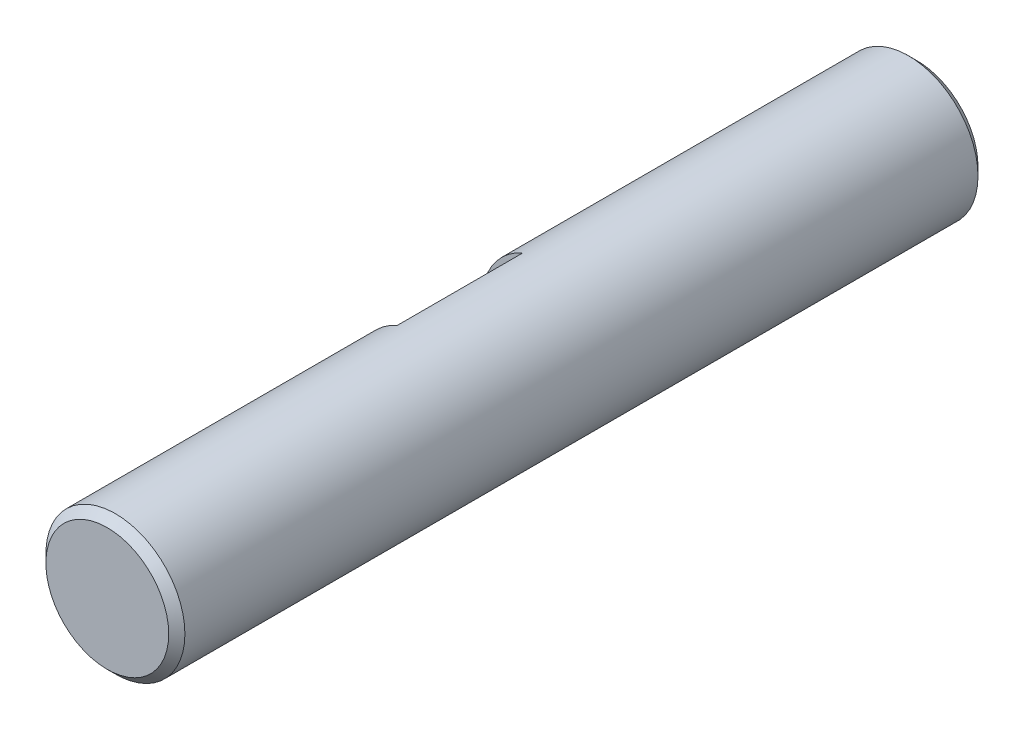
ISO-10303-21;
HEADER;
FILE_DESCRIPTION(('STEP AP214'),'2;1');
FILE_NAME('part.step','',(''),(''),'','','');
FILE_SCHEMA(('AUTOMOTIVE_DESIGN { 1 0 10303 214 1 1 1 1 }'));
ENDSEC;
DATA;
#1=APPLICATION_CONTEXT('core data for automotive mechanical design processes');
#2=APPLICATION_PROTOCOL_DEFINITION('international standard','automotive_design',2000,#1);
#3=PRODUCT_CONTEXT('',#1,'mechanical');
#4=PRODUCT('Part','Part','',(#3));
#5=PRODUCT_RELATED_PRODUCT_CATEGORY('part','',(#4));
#6=PRODUCT_DEFINITION_FORMATION('','',#4);
#7=PRODUCT_DEFINITION_CONTEXT('part definition',#1,'design');
#8=PRODUCT_DEFINITION('design','',#6,#7);
#9=PRODUCT_DEFINITION_SHAPE('','',#8);
#10=(LENGTH_UNIT() NAMED_UNIT(*) SI_UNIT(.MILLI.,.METRE.));
#11=(NAMED_UNIT(*) PLANE_ANGLE_UNIT() SI_UNIT($,.RADIAN.));
#12=(NAMED_UNIT(*) SI_UNIT($,.STERADIAN.) SOLID_ANGLE_UNIT());
#13=UNCERTAINTY_MEASURE_WITH_UNIT(LENGTH_MEASURE(1.E-05),#10,'distance_accuracy_value','');
#14=(GEOMETRIC_REPRESENTATION_CONTEXT(3) GLOBAL_UNCERTAINTY_ASSIGNED_CONTEXT((#13)) GLOBAL_UNIT_ASSIGNED_CONTEXT((#10,
#11,#12)) REPRESENTATION_CONTEXT('',''));
#15=CARTESIAN_POINT('',(0.,0.,0.));
#16=DIRECTION('',(0.,0.,1.));
#17=DIRECTION('',(1.,0.,0.));
#18=AXIS2_PLACEMENT_3D('',#15,#16,#17);
#19=CARTESIAN_POINT('',(0.,-4.38188552176432,-14.4100088425494));
#20=DIRECTION('',(0.,0.,1.));
#21=DIRECTION('',(0.,-1.,0.));
#22=AXIS2_PLACEMENT_3D('',#19,#20,#21);
#23=PLANE('',#22);
#24=CARTESIAN_POINT('',(0.,-4.38188552176432,-14.4100088425494));
#25=DIRECTION('',(0.,0.,1.));
#26=DIRECTION('',(-1.,0.,0.));
#27=AXIS2_PLACEMENT_3D('',#24,#25,#26);
#28=CIRCLE('',#27,2.19994112549696);
#29=CARTESIAN_POINT('',(2.19994112549687,-4.38188552176433,-14.4100088425494));
#30=VERTEX_POINT('',#29);
#31=EDGE_CURVE('E11',#30,#30,#28,.T.);
#32=ORIENTED_EDGE('',*,*,#31,.T.);
#33=EDGE_LOOP('',(#32));
#34=FACE_BOUND('',#33,.T.);
#35=ADVANCED_FACE('F17',(#34),#23,.T.);
#36=CARTESIAN_POINT('',(0.,-4.38188552176432,-14.5670382798009));
#37=DIRECTION('',(0.,0.,-1.));
#38=DIRECTION('',(-1.,0.,0.));
#39=AXIS2_PLACEMENT_3D('',#36,#37,#38);
#40=CONICAL_SURFACE('',#39,2.35697056274848,0.785398163397448);
#41=CARTESIAN_POINT('',(0.,-4.38188552176431,-14.7000677170524));
#42=DIRECTION('',(0.,0.,-1.));
#43=DIRECTION('',(-1.,0.,0.));
#44=AXIS2_PLACEMENT_3D('',#41,#42,#43);
#45=CIRCLE('',#44,2.49);
#46=CARTESIAN_POINT('',(2.49000000000006,-4.38188552176431,-14.7000677170524));
#47=VERTEX_POINT('',#46);
#48=EDGE_CURVE('E117',#47,#47,#45,.T.);
#49=ORIENTED_EDGE('',*,*,#48,.F.);
#50=DIRECTION('',(-0.707106781186547,0.,0.707106781186548));
#51=VECTOR('',#50,1.);
#52=CARTESIAN_POINT('',(2.35697056274839,-4.38188552176433,-14.5670382798009));
#53=LINE('',#52,#51);
#54=EDGE_CURVE('E28',#47,#30,#53,.T.);
#55=ORIENTED_EDGE('',*,*,#54,.T.);
#56=ORIENTED_EDGE('',*,*,#31,.F.);
#57=ORIENTED_EDGE('',*,*,#54,.F.);
#58=EDGE_LOOP('',(#49,#55,#56,#57));
#59=FACE_BOUND('',#58,.T.);
#60=ADVANCED_FACE('F19',(#59),#40,.T.);
#61=CARTESIAN_POINT('',(0.,-4.38188552176421,-43.4100093841559));
#62=DIRECTION('',(0.,0.,1.));
#63=DIRECTION('',(0.,-1.,0.));
#64=AXIS2_PLACEMENT_3D('',#61,#62,#63);
#65=PLANE('',#64);
#66=CARTESIAN_POINT('',(0.,-4.3818855217642,-43.4100093841559));
#67=DIRECTION('',(0.,0.,-1.));
#68=DIRECTION('',(-1.,0.,0.));
#69=AXIS2_PLACEMENT_3D('',#66,#67,#68);
#70=CIRCLE('',#69,2.19);
#71=CARTESIAN_POINT('',(2.18999999999995,-4.3818855217642,-43.4100093841559));
#72=VERTEX_POINT('',#71);
#73=EDGE_CURVE('E112',#72,#72,#70,.T.);
#74=ORIENTED_EDGE('',*,*,#73,.T.);
#75=EDGE_LOOP('',(#74));
#76=FACE_BOUND('',#75,.T.);
#77=ADVANCED_FACE('F133',(#76),#65,.F.);
#78=CARTESIAN_POINT('',(0.,-4.3818855217642,-47.3100047111516));
#79=DIRECTION('',(0.,0.,-1.));
#80=DIRECTION('',(-1.,0.,0.));
#81=AXIS2_PLACEMENT_3D('',#78,#79,#80);
#82=CYLINDRICAL_SURFACE('',#81,2.49);
#83=DIRECTION('',(0.,0.,-1.));
#84=VECTOR('',#83,1.);
#85=CARTESIAN_POINT('',(-1.00000000000037,-6.66225829830741,-47.3100047111516));
#86=LINE('',#85,#84);
#87=CARTESIAN_POINT('',(-1.00000000000037,-6.66225829830577,-25.8005378397317));
#88=VERTEX_POINT('',#87);
#89=CARTESIAN_POINT('',(-1.00000000000037,-6.66225829830459,-30.3005378397317));
#90=VERTEX_POINT('',#89);
#91=EDGE_CURVE('E87',#88,#90,#86,.T.);
#92=ORIENTED_EDGE('',*,*,#91,.T.);
#93=CARTESIAN_POINT('',(0.,-4.3818855217642,-30.3005378397311));
#94=DIRECTION('',(0.,2.54945547322589E-13,-1.));
#95=DIRECTION('',(-1.,0.,0.));
#96=AXIS2_PLACEMENT_3D('',#93,#94,#95);
#97=CIRCLE('',#96,2.49);
#98=CARTESIAN_POINT('',(-1.00000000000119,-2.10151274521792,-30.3005378397305));
#99=VERTEX_POINT('',#98);
#100=EDGE_CURVE('E78',#90,#99,#97,.T.);
#101=ORIENTED_EDGE('',*,*,#100,.T.);
#102=DIRECTION('',(0.,0.,1.));
#103=VECTOR('',#102,1.);
#104=CARTESIAN_POINT('',(-1.00000000000117,-2.10151274522135,-47.3100047111516));
#105=LINE('',#104,#103);
#106=CARTESIAN_POINT('',(-1.00000000000119,-2.10151274521909,-25.8005378397305));
#107=VERTEX_POINT('',#106);
#108=EDGE_CURVE('E84',#99,#107,#105,.T.);
#109=ORIENTED_EDGE('',*,*,#108,.T.);
#110=CARTESIAN_POINT('',(0.,-4.3818855217642,-25.8005378397311));
#111=DIRECTION('',(0.,-2.54945547322589E-13,1.));
#112=DIRECTION('',(-1.,0.,0.));
#113=AXIS2_PLACEMENT_3D('',#110,#111,#112);
#114=CIRCLE('',#113,2.49);
#115=EDGE_CURVE('E64',#107,#88,#114,.T.);
#116=ORIENTED_EDGE('',*,*,#115,.T.);
#117=EDGE_LOOP('',(#92,#101,#109,#116));
#118=FACE_BOUND('',#117,.T.);
#119=CARTESIAN_POINT('',(0.,-4.3818855217642,-43.1100093841559));
#120=DIRECTION('',(0.,0.,1.));
#121=DIRECTION('',(-1.,0.,0.));
#122=AXIS2_PLACEMENT_3D('',#119,#120,#121);
#123=CIRCLE('',#122,2.49);
#124=CARTESIAN_POINT('',(2.48999999999995,-4.3818855217642,-43.1100093841559));
#125=VERTEX_POINT('',#124);
#126=EDGE_CURVE('E90',#125,#125,#123,.T.);
#127=ORIENTED_EDGE('',*,*,#126,.T.);
#128=DIRECTION('',(0.,0.,1.));
#129=VECTOR('',#128,1.);
#130=CARTESIAN_POINT('',(2.48999999999995,-4.3818855217642,-47.3100047111516));
#131=LINE('',#130,#129);
#132=EDGE_CURVE('E21',#125,#47,#131,.T.);
#133=ORIENTED_EDGE('',*,*,#132,.T.);
#134=ORIENTED_EDGE('',*,*,#48,.T.);
#135=ORIENTED_EDGE('',*,*,#132,.F.);
#136=EDGE_LOOP('',(#127,#133,#134,#135));
#137=FACE_BOUND('',#136,.T.);
#138=ADVANCED_FACE('F83',(#118,#137),#82,.T.);
#139=CARTESIAN_POINT('',(0.,-4.3818855217642,-43.2600093841559));
#140=DIRECTION('',(0.,0.,1.));
#141=DIRECTION('',(-1.,0.,0.));
#142=AXIS2_PLACEMENT_3D('',#139,#140,#141);
#143=CONICAL_SURFACE('',#142,2.34,0.785398163397448);
#144=ORIENTED_EDGE('',*,*,#126,.F.);
#145=DIRECTION('',(-0.707106781186547,0.,-0.707106781186548));
#146=VECTOR('',#145,1.);
#147=CARTESIAN_POINT('',(2.33999999999995,-4.3818855217642,-43.2600093841559));
#148=LINE('',#147,#146);
#149=EDGE_CURVE('E109',#125,#72,#148,.T.);
#150=ORIENTED_EDGE('',*,*,#149,.T.);
#151=ORIENTED_EDGE('',*,*,#73,.F.);
#152=ORIENTED_EDGE('',*,*,#149,.F.);
#153=EDGE_LOOP('',(#144,#150,#151,#152));
#154=FACE_BOUND('',#153,.T.);
#155=ADVANCED_FACE('F136',(#154),#143,.T.);
#156=CARTESIAN_POINT('',(-7.46069872548105E-13,-4.38188552176108,-30.3005378397311));
#157=DIRECTION('',(0.,-2.54945547322589E-13,1.));
#158=DIRECTION('',(0.,-1.,-2.54945547322589E-13));
#159=AXIS2_PLACEMENT_3D('',#156,#157,#158);
#160=PLANE('',#159);
#161=ORIENTED_EDGE('',*,*,#100,.F.);
#162=DIRECTION('',(1.76025860554319E-13,-1.,-2.54945547322589E-13));
#163=VECTOR('',#162,1.);
#164=CARTESIAN_POINT('',(-1.00000000000158,0.118114531062581,-30.30053783973));
#165=LINE('',#164,#163);
#166=EDGE_CURVE('E94',#99,#90,#165,.T.);
#167=ORIENTED_EDGE('',*,*,#166,.F.);
#168=EDGE_LOOP('',(#161,#167));
#169=FACE_BOUND('',#168,.T.);
#170=ADVANCED_FACE('F98',(#169),#160,.T.);
#171=CARTESIAN_POINT('',(-7.46069872548105E-13,-4.38188552176225,-25.8005378397311));
#172=DIRECTION('',(0.,-2.54945547322589E-13,1.));
#173=DIRECTION('',(0.,-1.,-2.54945547322589E-13));
#174=AXIS2_PLACEMENT_3D('',#171,#172,#173);
#175=PLANE('',#174);
#176=ORIENTED_EDGE('',*,*,#115,.F.);
#177=DIRECTION('',(-1.76025860554319E-13,1.,2.54945547322589E-13));
#178=VECTOR('',#177,1.);
#179=CARTESIAN_POINT('',(-1.00000000000158,0.118114531061408,-25.80053783973));
#180=LINE('',#179,#178);
#181=EDGE_CURVE('E95',#88,#107,#180,.T.);
#182=ORIENTED_EDGE('',*,*,#181,.F.);
#183=EDGE_LOOP('',(#176,#182));
#184=FACE_BOUND('',#183,.T.);
#185=ADVANCED_FACE('F175',(#184),#175,.F.);
#186=CARTESIAN_POINT('',(-1.00000000000037,-6.66225829830459,-30.3005378397317));
#187=DIRECTION('',(1.,1.76025860554319E-13,0.));
#188=DIRECTION('',(-1.76025860554319E-13,1.,0.));
#189=AXIS2_PLACEMENT_3D('',#186,#187,#188);
#190=PLANE('',#189);
#191=ORIENTED_EDGE('',*,*,#166,.T.);
#192=ORIENTED_EDGE('',*,*,#91,.F.);
#193=ORIENTED_EDGE('',*,*,#181,.T.);
#194=ORIENTED_EDGE('',*,*,#108,.F.);
#195=EDGE_LOOP('',(#191,#192,#193,#194));
#196=FACE_BOUND('',#195,.T.);
#197=ADVANCED_FACE('F93',(#196),#190,.F.);
#198=CLOSED_SHELL('',(#35,#60,#77,#138,#155,#170,#185,#197));
#199=MANIFOLD_SOLID_BREP('B1',#198);
#200=ADVANCED_BREP_SHAPE_REPRESENTATION('',(#18,#199),#14);
#201=SHAPE_DEFINITION_REPRESENTATION(#9,#200);
ENDSEC;
END-ISO-10303-21;
